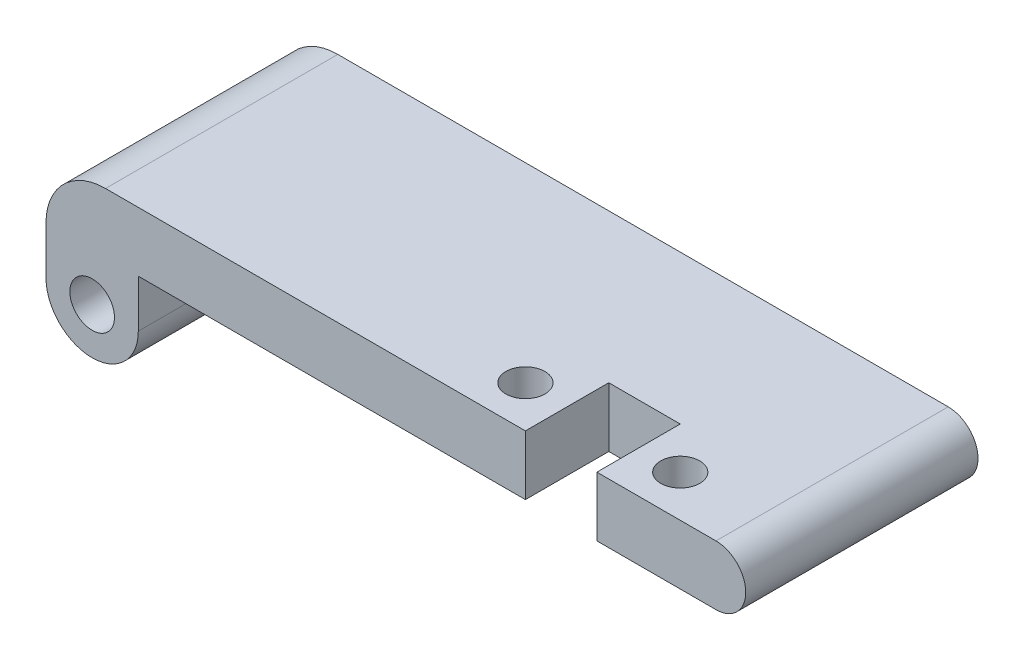
ISO-10303-21;
HEADER;
FILE_DESCRIPTION(('STEP AP214'),'2;1');
FILE_NAME('part.step','',(''),(''),'','','');
FILE_SCHEMA(('AUTOMOTIVE_DESIGN { 1 0 10303 214 1 1 1 1 }'));
ENDSEC;
DATA;
#1=APPLICATION_CONTEXT('core data for automotive mechanical design processes');
#2=APPLICATION_PROTOCOL_DEFINITION('international standard','automotive_design',2000,#1);
#3=PRODUCT_CONTEXT('',#1,'mechanical');
#4=PRODUCT('Part','Part','',(#3));
#5=PRODUCT_RELATED_PRODUCT_CATEGORY('part','',(#4));
#6=PRODUCT_DEFINITION_FORMATION('','',#4);
#7=PRODUCT_DEFINITION_CONTEXT('part definition',#1,'design');
#8=PRODUCT_DEFINITION('design','',#6,#7);
#9=PRODUCT_DEFINITION_SHAPE('','',#8);
#10=(LENGTH_UNIT() NAMED_UNIT(*) SI_UNIT(.MILLI.,.METRE.));
#11=(NAMED_UNIT(*) PLANE_ANGLE_UNIT() SI_UNIT($,.RADIAN.));
#12=(NAMED_UNIT(*) SI_UNIT($,.STERADIAN.) SOLID_ANGLE_UNIT());
#13=UNCERTAINTY_MEASURE_WITH_UNIT(LENGTH_MEASURE(1.E-05),#10,'distance_accuracy_value','');
#14=(GEOMETRIC_REPRESENTATION_CONTEXT(3) GLOBAL_UNCERTAINTY_ASSIGNED_CONTEXT((#13)) GLOBAL_UNIT_ASSIGNED_CONTEXT((#10,
#11,#12)) REPRESENTATION_CONTEXT('',''));
#15=CARTESIAN_POINT('',(0.,0.,0.));
#16=DIRECTION('',(0.,0.,1.));
#17=DIRECTION('',(1.,0.,0.));
#18=AXIS2_PLACEMENT_3D('',#15,#16,#17);
#19=CARTESIAN_POINT('',(-27.543125,-3.175,38.1));
#20=DIRECTION('',(0.,1.,0.));
#21=DIRECTION('',(0.,0.,1.));
#22=AXIS2_PLACEMENT_3D('',#19,#20,#21);
#23=PLANE('',#22);
#24=CARTESIAN_POINT('',(9.28687500000001,-3.175,20.32));
#25=DIRECTION('',(0.,1.,0.));
#26=DIRECTION('',(0.,0.,1.));
#27=AXIS2_PLACEMENT_3D('',#24,#25,#26);
#28=CIRCLE('',#27,2.0828);
#29=CARTESIAN_POINT('',(9.28687500000001,-3.175,18.2372));
#30=VERTEX_POINT('',#29);
#31=EDGE_CURVE('E265',#30,#30,#28,.F.);
#32=ORIENTED_EDGE('',*,*,#31,.F.);
#33=EDGE_LOOP('',(#32));
#34=FACE_BOUND('',#33,.T.);
#35=CARTESIAN_POINT('',(25.796875,-3.175,20.32));
#36=DIRECTION('',(0.,1.,0.));
#37=DIRECTION('',(0.,0.,1.));
#38=AXIS2_PLACEMENT_3D('',#35,#36,#37);
#39=CIRCLE('',#38,2.0828);
#40=CARTESIAN_POINT('',(25.796875,-3.175,18.2372));
#41=VERTEX_POINT('',#40);
#42=EDGE_CURVE('E279',#41,#41,#39,.F.);
#43=ORIENTED_EDGE('',*,*,#42,.F.);
#44=EDGE_LOOP('',(#43));
#45=FACE_BOUND('',#44,.T.);
#46=DIRECTION('',(0.,0.,1.));
#47=VECTOR('',#46,1.);
#48=CARTESIAN_POINT('',(34.051875,-3.175,0.));
#49=LINE('',#48,#47);
#50=CARTESIAN_POINT('',(34.051875,-3.175,0.));
#51=VERTEX_POINT('',#50);
#52=CARTESIAN_POINT('',(34.051875,-3.175,24.765));
#53=VERTEX_POINT('',#52);
#54=EDGE_CURVE('E123',#51,#53,#49,.T.);
#55=ORIENTED_EDGE('',*,*,#54,.T.);
#56=DIRECTION('',(-1.,0.,0.));
#57=VECTOR('',#56,1.);
#58=CARTESIAN_POINT('',(-27.543125,-3.175,24.765));
#59=LINE('',#58,#57);
#60=CARTESIAN_POINT('',(21.351875,-3.175,24.765));
#61=VERTEX_POINT('',#60);
#62=EDGE_CURVE('E65',#53,#61,#59,.T.);
#63=ORIENTED_EDGE('',*,*,#62,.T.);
#64=DIRECTION('',(0.,0.,-1.));
#65=VECTOR('',#64,1.);
#66=CARTESIAN_POINT('',(21.351875,-3.175,24.765));
#67=LINE('',#66,#65);
#68=CARTESIAN_POINT('',(21.351875,-3.175,15.875));
#69=VERTEX_POINT('',#68);
#70=EDGE_CURVE('E280',#61,#69,#67,.T.);
#71=ORIENTED_EDGE('',*,*,#70,.T.);
#72=DIRECTION('',(-1.,0.,0.));
#73=VECTOR('',#72,1.);
#74=CARTESIAN_POINT('',(-27.543125,-3.175,15.875));
#75=LINE('',#74,#73);
#76=CARTESIAN_POINT('',(13.731875,-3.175,15.875));
#77=VERTEX_POINT('',#76);
#78=EDGE_CURVE('E257',#69,#77,#75,.T.);
#79=ORIENTED_EDGE('',*,*,#78,.T.);
#80=DIRECTION('',(0.,0.,1.));
#81=VECTOR('',#80,1.);
#82=CARTESIAN_POINT('',(13.731875,-3.175,15.875));
#83=LINE('',#82,#81);
#84=CARTESIAN_POINT('',(13.731875,-3.175,24.765));
#85=VERTEX_POINT('',#84);
#86=EDGE_CURVE('E255',#77,#85,#83,.T.);
#87=ORIENTED_EDGE('',*,*,#86,.T.);
#88=CARTESIAN_POINT('',(-27.543125,-3.175,24.765));
#89=VERTEX_POINT('',#88);
#90=EDGE_CURVE('E204',#85,#89,#59,.T.);
#91=ORIENTED_EDGE('',*,*,#90,.T.);
#92=DIRECTION('',(0.,0.,-1.));
#93=VECTOR('',#92,1.);
#94=CARTESIAN_POINT('',(-27.543125,-3.175,38.1));
#95=LINE('',#94,#93);
#96=CARTESIAN_POINT('',(-27.543125,-3.175,0.));
#97=VERTEX_POINT('',#96);
#98=EDGE_CURVE('E144',#89,#97,#95,.T.);
#99=ORIENTED_EDGE('',*,*,#98,.T.);
#100=DIRECTION('',(1.,0.,0.));
#101=VECTOR('',#100,1.);
#102=CARTESIAN_POINT('',(-27.543125,-3.175,0.));
#103=LINE('',#102,#101);
#104=EDGE_CURVE('E137',#97,#51,#103,.T.);
#105=ORIENTED_EDGE('',*,*,#104,.T.);
#106=EDGE_LOOP('',(#55,#63,#71,#79,#87,#91,#99,#105));
#107=FACE_BOUND('',#106,.T.);
#108=ADVANCED_FACE('F41',(#34,#45,#107),#23,.F.);
#109=CARTESIAN_POINT('',(21.351875,-6.35,24.765));
#110=DIRECTION('',(0.,0.,1.));
#111=DIRECTION('',(1.,0.,0.));
#112=AXIS2_PLACEMENT_3D('',#109,#110,#111);
#113=PLANE('',#112);
#114=ORIENTED_EDGE('',*,*,#90,.F.);
#115=DIRECTION('',(0.,1.,0.));
#116=VECTOR('',#115,1.);
#117=CARTESIAN_POINT('',(13.731875,-13.17625,24.765));
#118=LINE('',#117,#116);
#119=CARTESIAN_POINT('',(13.731875,3.17499999999999,24.765));
#120=VERTEX_POINT('',#119);
#121=EDGE_CURVE('E270',#85,#120,#118,.T.);
#122=ORIENTED_EDGE('',*,*,#121,.T.);
#123=DIRECTION('',(1.,0.,0.));
#124=VECTOR('',#123,1.);
#125=CARTESIAN_POINT('',(50.085625,3.175,24.765));
#126=LINE('',#125,#124);
#127=CARTESIAN_POINT('',(-31.035625,3.175,24.765));
#128=VERTEX_POINT('',#127);
#129=EDGE_CURVE('E180',#128,#120,#126,.T.);
#130=ORIENTED_EDGE('',*,*,#129,.F.);
#131=CARTESIAN_POINT('',(-31.035625,-3.175,24.765));
#132=DIRECTION('',(0.,0.,1.));
#133=DIRECTION('',(1.,0.,0.));
#134=AXIS2_PLACEMENT_3D('',#131,#132,#133);
#135=CIRCLE('',#134,6.35);
#136=CARTESIAN_POINT('',(-37.385625,-3.175,24.765));
#137=VERTEX_POINT('',#136);
#138=EDGE_CURVE('E174',#137,#128,#135,.F.);
#139=ORIENTED_EDGE('',*,*,#138,.F.);
#140=DIRECTION('',(0.,1.,0.));
#141=VECTOR('',#140,1.);
#142=CARTESIAN_POINT('',(-37.385625,-3.175,24.765));
#143=LINE('',#142,#141);
#144=CARTESIAN_POINT('',(-37.385625,-8.255,24.765));
#145=VERTEX_POINT('',#144);
#146=EDGE_CURVE('E210',#145,#137,#143,.T.);
#147=ORIENTED_EDGE('',*,*,#146,.F.);
#148=CARTESIAN_POINT('',(-32.464375,-8.255,24.765));
#149=DIRECTION('',(0.,0.,1.));
#150=DIRECTION('',(1.,0.,0.));
#151=AXIS2_PLACEMENT_3D('',#148,#149,#150);
#152=CIRCLE('',#151,4.92125);
#153=CARTESIAN_POINT('',(-27.543125,-8.255,24.765));
#154=VERTEX_POINT('',#153);
#155=EDGE_CURVE('E205',#154,#145,#152,.F.);
#156=ORIENTED_EDGE('',*,*,#155,.F.);
#157=DIRECTION('',(0.,-1.,0.));
#158=VECTOR('',#157,1.);
#159=CARTESIAN_POINT('',(-27.543125,-8.255,24.765));
#160=LINE('',#159,#158);
#161=EDGE_CURVE('E201',#89,#154,#160,.T.);
#162=ORIENTED_EDGE('',*,*,#161,.F.);
#163=EDGE_LOOP('',(#114,#122,#130,#139,#147,#156,#162));
#164=FACE_BOUND('',#163,.T.);
#165=CARTESIAN_POINT('',(-32.464375,-8.255,24.765));
#166=DIRECTION('',(0.,0.,1.));
#167=DIRECTION('',(1.,0.,0.));
#168=AXIS2_PLACEMENT_3D('',#165,#166,#167);
#169=CIRCLE('',#168,2.38125);
#170=CARTESIAN_POINT('',(-34.845625,-8.255,24.765));
#171=VERTEX_POINT('',#170);
#172=EDGE_CURVE('E220',#171,#171,#169,.T.);
#173=ORIENTED_EDGE('',*,*,#172,.F.);
#174=EDGE_LOOP('',(#173));
#175=FACE_BOUND('',#174,.T.);
#176=ADVANCED_FACE('F276',(#164,#175),#113,.T.);
#177=CARTESIAN_POINT('',(-37.385625,3.175,38.1));
#178=DIRECTION('',(0.,-1.,0.));
#179=DIRECTION('',(0.,0.,-1.));
#180=AXIS2_PLACEMENT_3D('',#177,#178,#179);
#181=PLANE('',#180);
#182=CARTESIAN_POINT('',(25.796875,3.175,20.32));
#183=DIRECTION('',(0.,-1.,0.));
#184=DIRECTION('',(0.,0.,-1.));
#185=AXIS2_PLACEMENT_3D('',#182,#183,#184);
#186=CIRCLE('',#185,2.0828);
#187=CARTESIAN_POINT('',(25.796875,3.175,18.2372));
#188=VERTEX_POINT('',#187);
#189=EDGE_CURVE('E224',#188,#188,#186,.T.);
#190=ORIENTED_EDGE('',*,*,#189,.T.);
#191=EDGE_LOOP('',(#190));
#192=FACE_BOUND('',#191,.T.);
#193=CARTESIAN_POINT('',(9.28687500000001,3.175,20.32));
#194=DIRECTION('',(0.,-1.,0.));
#195=DIRECTION('',(0.,0.,-1.));
#196=AXIS2_PLACEMENT_3D('',#193,#194,#195);
#197=CIRCLE('',#196,2.0828);
#198=CARTESIAN_POINT('',(9.28687500000001,3.175,18.2372));
#199=VERTEX_POINT('',#198);
#200=EDGE_CURVE('E228',#199,#199,#197,.T.);
#201=ORIENTED_EDGE('',*,*,#200,.T.);
#202=EDGE_LOOP('',(#201));
#203=FACE_BOUND('',#202,.T.);
#204=CARTESIAN_POINT('',(21.351875,3.17499999999999,24.765));
#205=VERTEX_POINT('',#204);
#206=CARTESIAN_POINT('',(34.051875,3.175,24.765));
#207=VERTEX_POINT('',#206);
#208=EDGE_CURVE('E215',#205,#207,#126,.T.);
#209=ORIENTED_EDGE('',*,*,#208,.T.);
#210=DIRECTION('',(0.,0.,1.));
#211=VECTOR('',#210,1.);
#212=CARTESIAN_POINT('',(34.051875,3.17499999999999,0.));
#213=LINE('',#212,#211);
#214=CARTESIAN_POINT('',(34.051875,3.17499999999999,0.));
#215=VERTEX_POINT('',#214);
#216=EDGE_CURVE('E57',#215,#207,#213,.T.);
#217=ORIENTED_EDGE('',*,*,#216,.F.);
#218=DIRECTION('',(-1.,0.,0.));
#219=VECTOR('',#218,1.);
#220=CARTESIAN_POINT('',(-37.385625,3.175,0.));
#221=LINE('',#220,#219);
#222=CARTESIAN_POINT('',(-31.035625,3.175,0.));
#223=VERTEX_POINT('',#222);
#224=EDGE_CURVE('E139',#215,#223,#221,.T.);
#225=ORIENTED_EDGE('',*,*,#224,.T.);
#226=DIRECTION('',(0.,0.,-1.));
#227=VECTOR('',#226,1.);
#228=CARTESIAN_POINT('',(-31.035625,3.175,38.1));
#229=LINE('',#228,#227);
#230=EDGE_CURVE('E11',#223,#128,#229,.F.);
#231=ORIENTED_EDGE('',*,*,#230,.T.);
#232=ORIENTED_EDGE('',*,*,#129,.T.);
#233=DIRECTION('',(0.,0.,1.));
#234=VECTOR('',#233,1.);
#235=CARTESIAN_POINT('',(13.731875,3.175,24.765));
#236=LINE('',#235,#234);
#237=CARTESIAN_POINT('',(13.731875,3.17499999999999,15.875));
#238=VERTEX_POINT('',#237);
#239=EDGE_CURVE('E232',#238,#120,#236,.T.);
#240=ORIENTED_EDGE('',*,*,#239,.F.);
#241=DIRECTION('',(-1.,0.,0.));
#242=VECTOR('',#241,1.);
#243=CARTESIAN_POINT('',(21.351875,3.175,15.875));
#244=LINE('',#243,#242);
#245=CARTESIAN_POINT('',(21.351875,3.17499999999999,15.875));
#246=VERTEX_POINT('',#245);
#247=EDGE_CURVE('E188',#246,#238,#244,.T.);
#248=ORIENTED_EDGE('',*,*,#247,.F.);
#249=DIRECTION('',(0.,0.,-1.));
#250=VECTOR('',#249,1.);
#251=CARTESIAN_POINT('',(21.351875,3.175,24.765));
#252=LINE('',#251,#250);
#253=EDGE_CURVE('E236',#205,#246,#252,.T.);
#254=ORIENTED_EDGE('',*,*,#253,.F.);
#255=EDGE_LOOP('',(#209,#217,#225,#231,#232,#240,#248,#254));
#256=FACE_BOUND('',#255,.T.);
#257=ADVANCED_FACE('F178',(#192,#203,#256),#181,.F.);
#258=CARTESIAN_POINT('',(-37.385625,-8.255,38.1));
#259=DIRECTION('',(1.,0.,0.));
#260=DIRECTION('',(0.,0.,-1.));
#261=AXIS2_PLACEMENT_3D('',#258,#259,#260);
#262=PLANE('',#261);
#263=ORIENTED_EDGE('',*,*,#146,.T.);
#264=DIRECTION('',(0.,0.,-1.));
#265=VECTOR('',#264,1.);
#266=CARTESIAN_POINT('',(-37.385625,-3.175,38.1));
#267=LINE('',#266,#265);
#268=CARTESIAN_POINT('',(-37.385625,-3.175,0.));
#269=VERTEX_POINT('',#268);
#270=EDGE_CURVE('E162',#137,#269,#267,.T.);
#271=ORIENTED_EDGE('',*,*,#270,.T.);
#272=DIRECTION('',(0.,-1.,0.));
#273=VECTOR('',#272,1.);
#274=CARTESIAN_POINT('',(-37.385625,-8.255,0.));
#275=LINE('',#274,#273);
#276=CARTESIAN_POINT('',(-37.385625,-8.255,0.));
#277=VERTEX_POINT('',#276);
#278=EDGE_CURVE('E170',#269,#277,#275,.T.);
#279=ORIENTED_EDGE('',*,*,#278,.T.);
#280=DIRECTION('',(0.,0.,-1.));
#281=VECTOR('',#280,1.);
#282=CARTESIAN_POINT('',(-37.385625,-8.255,38.1));
#283=LINE('',#282,#281);
#284=EDGE_CURVE('E159',#145,#277,#283,.T.);
#285=ORIENTED_EDGE('',*,*,#284,.F.);
#286=EDGE_LOOP('',(#263,#271,#279,#285));
#287=FACE_BOUND('',#286,.T.);
#288=ADVANCED_FACE('F275',(#287),#262,.F.);
#289=CARTESIAN_POINT('',(-32.464375,-8.255,38.1));
#290=DIRECTION('',(0.,0.,-1.));
#291=DIRECTION('',(-1.,0.,0.));
#292=AXIS2_PLACEMENT_3D('',#289,#290,#291);
#293=CYLINDRICAL_SURFACE('',#292,4.92125);
#294=ORIENTED_EDGE('',*,*,#155,.T.);
#295=ORIENTED_EDGE('',*,*,#284,.T.);
#296=CARTESIAN_POINT('',(-32.464375,-8.255,0.));
#297=DIRECTION('',(0.,0.,1.));
#298=DIRECTION('',(1.,0.,0.));
#299=AXIS2_PLACEMENT_3D('',#296,#297,#298);
#300=CIRCLE('',#299,4.92125);
#301=CARTESIAN_POINT('',(-27.543125,-8.255,0.));
#302=VERTEX_POINT('',#301);
#303=EDGE_CURVE('E153',#277,#302,#300,.T.);
#304=ORIENTED_EDGE('',*,*,#303,.T.);
#305=DIRECTION('',(0.,0.,-1.));
#306=VECTOR('',#305,1.);
#307=CARTESIAN_POINT('',(-27.543125,-8.255,38.1));
#308=LINE('',#307,#306);
#309=EDGE_CURVE('E151',#154,#302,#308,.T.);
#310=ORIENTED_EDGE('',*,*,#309,.F.);
#311=EDGE_LOOP('',(#294,#295,#304,#310));
#312=FACE_BOUND('',#311,.T.);
#313=ADVANCED_FACE('F196',(#312),#293,.T.);
#314=CARTESIAN_POINT('',(-27.543125,-8.255,38.1));
#315=DIRECTION('',(-1.,0.,0.));
#316=DIRECTION('',(0.,0.,1.));
#317=AXIS2_PLACEMENT_3D('',#314,#315,#316);
#318=PLANE('',#317);
#319=ORIENTED_EDGE('',*,*,#161,.T.);
#320=ORIENTED_EDGE('',*,*,#309,.T.);
#321=DIRECTION('',(0.,1.,0.));
#322=VECTOR('',#321,1.);
#323=CARTESIAN_POINT('',(-27.543125,-8.255,0.));
#324=LINE('',#323,#322);
#325=EDGE_CURVE('E147',#302,#97,#324,.T.);
#326=ORIENTED_EDGE('',*,*,#325,.T.);
#327=ORIENTED_EDGE('',*,*,#98,.F.);
#328=EDGE_LOOP('',(#319,#320,#326,#327));
#329=FACE_BOUND('',#328,.T.);
#330=ADVANCED_FACE('F200',(#329),#318,.F.);
#331=CARTESIAN_POINT('',(-32.464375,-8.255,38.1));
#332=DIRECTION('',(0.,0.,-1.));
#333=DIRECTION('',(-1.,0.,0.));
#334=AXIS2_PLACEMENT_3D('',#331,#332,#333);
#335=CYLINDRICAL_SURFACE('',#334,2.38125);
#336=CARTESIAN_POINT('',(-32.464375,-8.255,0.));
#337=DIRECTION('',(0.,0.,1.));
#338=DIRECTION('',(1.,0.,0.));
#339=AXIS2_PLACEMENT_3D('',#336,#337,#338);
#340=CIRCLE('',#339,2.38125);
#341=CARTESIAN_POINT('',(-34.845625,-8.255,0.));
#342=VERTEX_POINT('',#341);
#343=EDGE_CURVE('E182',#342,#342,#340,.T.);
#344=CARTESIAN_POINT('',(-34.845625,-8.255,0.));
#345=CARTESIAN_POINT('',(-34.845625,-8.255,0.257968749999999));
#346=CARTESIAN_POINT('',(-34.845625,-8.255,0.515937499999998));
#347=CARTESIAN_POINT('',(-34.845625,-8.255,1.031875));
#348=CARTESIAN_POINT('',(-34.845625,-8.255,1.28984375));
#349=CARTESIAN_POINT('',(-34.845625,-8.255,1.80578125));
#350=CARTESIAN_POINT('',(-34.845625,-8.255,2.06375));
#351=CARTESIAN_POINT('',(-34.845625,-8.255,2.5796875));
#352=CARTESIAN_POINT('',(-34.845625,-8.255,2.83765625));
#353=CARTESIAN_POINT('',(-34.845625,-8.255,3.35359375));
#354=CARTESIAN_POINT('',(-34.845625,-8.255,3.6115625));
#355=CARTESIAN_POINT('',(-34.845625,-8.255,4.1275));
#356=CARTESIAN_POINT('',(-34.845625,-8.255,4.38546875000001));
#357=CARTESIAN_POINT('',(-34.845625,-8.255,4.90140625000001));
#358=CARTESIAN_POINT('',(-34.845625,-8.255,5.15937500000001));
#359=CARTESIAN_POINT('',(-34.845625,-8.255,5.67531250000001));
#360=CARTESIAN_POINT('',(-34.845625,-8.255,5.93328125000001));
#361=CARTESIAN_POINT('',(-34.845625,-8.255,6.44921875000001));
#362=CARTESIAN_POINT('',(-34.845625,-8.255,6.70718750000001));
#363=CARTESIAN_POINT('',(-34.845625,-8.255,7.22312500000001));
#364=CARTESIAN_POINT('',(-34.845625,-8.255,7.48109375000001));
#365=CARTESIAN_POINT('',(-34.845625,-8.255,7.99703125000001));
#366=CARTESIAN_POINT('',(-34.845625,-8.255,8.25500000000001));
#367=CARTESIAN_POINT('',(-34.845625,-8.255,8.77093750000001));
#368=CARTESIAN_POINT('',(-34.845625,-8.255,9.02890625000001));
#369=CARTESIAN_POINT('',(-34.845625,-8.255,9.54484375000001));
#370=CARTESIAN_POINT('',(-34.845625,-8.255,9.80281250000001));
#371=CARTESIAN_POINT('',(-34.845625,-8.255,10.31875));
#372=CARTESIAN_POINT('',(-34.845625,-8.255,10.57671875));
#373=CARTESIAN_POINT('',(-34.845625,-8.255,11.09265625));
#374=CARTESIAN_POINT('',(-34.845625,-8.255,11.350625));
#375=CARTESIAN_POINT('',(-34.845625,-8.255,11.8665625));
#376=CARTESIAN_POINT('',(-34.845625,-8.255,12.12453125));
#377=CARTESIAN_POINT('',(-34.845625,-8.255,12.64046875));
#378=CARTESIAN_POINT('',(-34.845625,-8.255,12.8984375));
#379=CARTESIAN_POINT('',(-34.845625,-8.255,13.414375));
#380=CARTESIAN_POINT('',(-34.845625,-8.255,13.67234375));
#381=CARTESIAN_POINT('',(-34.845625,-8.255,14.18828125));
#382=CARTESIAN_POINT('',(-34.845625,-8.255,14.44625));
#383=CARTESIAN_POINT('',(-34.845625,-8.255,14.9621875));
#384=CARTESIAN_POINT('',(-34.845625,-8.255,15.22015625));
#385=CARTESIAN_POINT('',(-34.845625,-8.255,15.73609375));
#386=CARTESIAN_POINT('',(-34.845625,-8.255,15.9940625));
#387=CARTESIAN_POINT('',(-34.845625,-8.255,16.51));
#388=CARTESIAN_POINT('',(-34.845625,-8.255,16.76796875));
#389=CARTESIAN_POINT('',(-34.845625,-8.255,17.28390625));
#390=CARTESIAN_POINT('',(-34.845625,-8.255,17.541875));
#391=CARTESIAN_POINT('',(-34.845625,-8.255,18.0578125));
#392=CARTESIAN_POINT('',(-34.845625,-8.255,18.31578125));
#393=CARTESIAN_POINT('',(-34.845625,-8.255,18.83171875));
#394=CARTESIAN_POINT('',(-34.845625,-8.255,19.0896875));
#395=CARTESIAN_POINT('',(-34.845625,-8.255,19.605625));
#396=CARTESIAN_POINT('',(-34.845625,-8.255,19.86359375));
#397=CARTESIAN_POINT('',(-34.845625,-8.255,20.37953125));
#398=CARTESIAN_POINT('',(-34.845625,-8.255,20.6375));
#399=CARTESIAN_POINT('',(-34.845625,-8.255,21.1534375));
#400=CARTESIAN_POINT('',(-34.845625,-8.255,21.41140625));
#401=CARTESIAN_POINT('',(-34.845625,-8.255,21.92734375));
#402=CARTESIAN_POINT('',(-34.845625,-8.255,22.1853125));
#403=CARTESIAN_POINT('',(-34.845625,-8.255,22.70125));
#404=CARTESIAN_POINT('',(-34.845625,-8.255,22.95921875));
#405=CARTESIAN_POINT('',(-34.845625,-8.255,23.47515625));
#406=CARTESIAN_POINT('',(-34.845625,-8.255,23.733125));
#407=CARTESIAN_POINT('',(-34.845625,-8.255,24.2490625));
#408=CARTESIAN_POINT('',(-34.845625,-8.255,24.50703125));
#409=CARTESIAN_POINT('',(-34.845625,-8.255,24.765));
#410=B_SPLINE_CURVE_WITH_KNOTS('',3,(#344,#345,#346,#347,#348,#349,#350,#351,#352,#353,#354,
#355,#356,#357,#358,#359,#360,#361,#362,#363,#364,#365,#366,#367,#368,#369,#370,#371,#372,#373,
#374,#375,#376,#377,#378,#379,#380,#381,#382,#383,#384,#385,#386,#387,#388,#389,#390,#391,#392,
#393,#394,#395,#396,#397,#398,#399,#400,#401,#402,#403,#404,#405,#406,#407,#408,#409),
.UNSPECIFIED.,.F.,.F.,(4,2,2,2,2,2,2,2,2,2,2,2,2,2,2,2,2,2,2,2,2,2,2,2,2,2,2,2,2,2,2,2,4),(0.,
0.773906249999998,1.5478125,2.32171875,3.095625,3.86953125,4.64343750000001,5.41734375000001,
6.19125000000001,6.96515625000001,7.73906250000001,8.51296875000001,9.28687500000001,
10.06078125,10.8346875,11.60859375,12.3825,13.15640625,13.9303125,14.70421875,15.478125,
16.25203125,17.0259375,17.79984375,18.57375,19.34765625,20.1215625,20.89546875,21.669375,
22.44328125,23.2171875,23.99109375,24.765),.UNSPECIFIED.);
#411=EDGE_CURVE('BSEAM320',#342,#171,#410,.T.);
#412=ORIENTED_EDGE('',*,*,#343,.F.);
#413=ORIENTED_EDGE('',*,*,#172,.T.);
#414=ORIENTED_EDGE('',*,*,#411,.T.);
#415=ORIENTED_EDGE('',*,*,#411,.F.);
#416=EDGE_LOOP('',(#412,#414,#413,#415));
#417=FACE_BOUND('',#416,.T.);
#418=ADVANCED_FACE('F320',(#417),#335,.F.);
#419=CARTESIAN_POINT('',(-31.035625,-3.175,38.1));
#420=DIRECTION('',(0.,0.,-1.));
#421=DIRECTION('',(-1.,0.,0.));
#422=AXIS2_PLACEMENT_3D('',#419,#420,#421);
#423=CYLINDRICAL_SURFACE('',#422,6.35);
#424=ORIENTED_EDGE('',*,*,#270,.F.);
#425=ORIENTED_EDGE('',*,*,#138,.T.);
#426=ORIENTED_EDGE('',*,*,#230,.F.);
#427=CARTESIAN_POINT('',(-31.035625,-3.175,0.));
#428=DIRECTION('',(0.,0.,1.));
#429=DIRECTION('',(1.,0.,0.));
#430=AXIS2_PLACEMENT_3D('',#427,#428,#429);
#431=CIRCLE('',#430,6.35);
#432=EDGE_CURVE('E50',#269,#223,#431,.F.);
#433=ORIENTED_EDGE('',*,*,#432,.F.);
#434=EDGE_LOOP('',(#424,#425,#426,#433));
#435=FACE_BOUND('',#434,.T.);
#436=ADVANCED_FACE('F43',(#435),#423,.T.);
#437=CARTESIAN_POINT('',(-32.464375,-8.255,0.));
#438=DIRECTION('',(0.,0.,1.));
#439=DIRECTION('',(1.,0.,0.));
#440=AXIS2_PLACEMENT_3D('',#437,#438,#439);
#441=PLANE('',#440);
#442=ORIENTED_EDGE('',*,*,#224,.F.);
#443=CARTESIAN_POINT('',(34.051875,0.,0.));
#444=DIRECTION('',(0.,0.,-1.));
#445=DIRECTION('',(1.,0.,0.));
#446=AXIS2_PLACEMENT_3D('',#443,#444,#445);
#447=CIRCLE('',#446,3.175);
#448=EDGE_CURVE('E126',#215,#51,#447,.T.);
#449=ORIENTED_EDGE('',*,*,#448,.T.);
#450=ORIENTED_EDGE('',*,*,#104,.F.);
#451=ORIENTED_EDGE('',*,*,#325,.F.);
#452=ORIENTED_EDGE('',*,*,#303,.F.);
#453=ORIENTED_EDGE('',*,*,#278,.F.);
#454=ORIENTED_EDGE('',*,*,#432,.T.);
#455=EDGE_LOOP('',(#442,#449,#450,#451,#452,#453,#454));
#456=FACE_BOUND('',#455,.T.);
#457=ORIENTED_EDGE('',*,*,#343,.T.);
#458=EDGE_LOOP('',(#457));
#459=FACE_BOUND('',#458,.T.);
#460=ADVANCED_FACE('F134',(#456,#459),#441,.F.);
#461=CARTESIAN_POINT('',(34.051875,0.,24.765));
#462=DIRECTION('',(0.,0.,-1.));
#463=DIRECTION('',(1.,0.,0.));
#464=AXIS2_PLACEMENT_3D('',#461,#462,#463);
#465=CIRCLE('',#464,3.175);
#466=EDGE_CURVE('E127',#207,#53,#465,.T.);
#467=ORIENTED_EDGE('',*,*,#466,.F.);
#468=ORIENTED_EDGE('',*,*,#208,.F.);
#469=DIRECTION('',(0.,1.,0.));
#470=VECTOR('',#469,1.);
#471=CARTESIAN_POINT('',(21.351875,-13.17625,24.765));
#472=LINE('',#471,#470);
#473=EDGE_CURVE('E262',#61,#205,#472,.T.);
#474=ORIENTED_EDGE('',*,*,#473,.F.);
#475=ORIENTED_EDGE('',*,*,#62,.F.);
#476=EDGE_LOOP('',(#467,#468,#474,#475));
#477=FACE_BOUND('',#476,.T.);
#478=ADVANCED_FACE('F296',(#477),#113,.T.);
#479=CARTESIAN_POINT('',(25.796875,25.4,20.32));
#480=DIRECTION('',(0.,-1.,0.));
#481=DIRECTION('',(0.,0.,-1.));
#482=AXIS2_PLACEMENT_3D('',#479,#480,#481);
#483=CYLINDRICAL_SURFACE('',#482,2.0828);
#484=CARTESIAN_POINT('',(25.796875,-3.175,18.2372));
#485=CARTESIAN_POINT('',(25.796875,-3.10885416666666,18.2372));
#486=CARTESIAN_POINT('',(25.796875,-3.04270833333333,18.2372));
#487=CARTESIAN_POINT('',(25.796875,-2.91041666666666,18.2372));
#488=CARTESIAN_POINT('',(25.796875,-2.84427083333333,18.2372));
#489=CARTESIAN_POINT('',(25.796875,-2.71197916666666,18.2372));
#490=CARTESIAN_POINT('',(25.796875,-2.64583333333333,18.2372));
#491=CARTESIAN_POINT('',(25.796875,-2.51354166666666,18.2372));
#492=CARTESIAN_POINT('',(25.796875,-2.44739583333333,18.2372));
#493=CARTESIAN_POINT('',(25.796875,-2.31510416666666,18.2372));
#494=CARTESIAN_POINT('',(25.796875,-2.24895833333333,18.2372));
#495=CARTESIAN_POINT('',(25.796875,-2.11666666666666,18.2372));
#496=CARTESIAN_POINT('',(25.796875,-2.05052083333333,18.2372));
#497=CARTESIAN_POINT('',(25.796875,-1.91822916666666,18.2372));
#498=CARTESIAN_POINT('',(25.796875,-1.85208333333333,18.2372));
#499=CARTESIAN_POINT('',(25.796875,-1.71979166666666,18.2372));
#500=CARTESIAN_POINT('',(25.796875,-1.65364583333333,18.2372));
#501=CARTESIAN_POINT('',(25.796875,-1.52135416666666,18.2372));
#502=CARTESIAN_POINT('',(25.796875,-1.45520833333333,18.2372));
#503=CARTESIAN_POINT('',(25.796875,-1.32291666666666,18.2372));
#504=CARTESIAN_POINT('',(25.796875,-1.25677083333333,18.2372));
#505=CARTESIAN_POINT('',(25.796875,-1.12447916666666,18.2372));
#506=CARTESIAN_POINT('',(25.796875,-1.05833333333333,18.2372));
#507=CARTESIAN_POINT('',(25.796875,-0.926041666666664,18.2372));
#508=CARTESIAN_POINT('',(25.796875,-0.85989583333333,18.2372));
#509=CARTESIAN_POINT('',(25.796875,-0.727604166666663,18.2372));
#510=CARTESIAN_POINT('',(25.796875,-0.66145833333333,18.2372));
#511=CARTESIAN_POINT('',(25.796875,-0.529166666666664,18.2372));
#512=CARTESIAN_POINT('',(25.796875,-0.463020833333331,18.2372));
#513=CARTESIAN_POINT('',(25.796875,-0.330729166666664,18.2372));
#514=CARTESIAN_POINT('',(25.796875,-0.26458333333333,18.2372));
#515=CARTESIAN_POINT('',(25.796875,-0.132291666666663,18.2372));
#516=CARTESIAN_POINT('',(25.796875,-0.0661458333333295,18.2372));
#517=CARTESIAN_POINT('',(25.796875,0.0661458333333365,18.2372));
#518=CARTESIAN_POINT('',(25.796875,0.132291666666669,18.2372));
#519=CARTESIAN_POINT('',(25.796875,0.264583333333337,18.2372));
#520=CARTESIAN_POINT('',(25.796875,0.330729166666671,18.2372));
#521=CARTESIAN_POINT('',(25.796875,0.463020833333338,18.2372));
#522=CARTESIAN_POINT('',(25.796875,0.529166666666671,18.2372));
#523=CARTESIAN_POINT('',(25.796875,0.661458333333337,18.2372));
#524=CARTESIAN_POINT('',(25.796875,0.72760416666667,18.2372));
#525=CARTESIAN_POINT('',(25.796875,0.859895833333337,18.2372));
#526=CARTESIAN_POINT('',(25.796875,0.926041666666671,18.2372));
#527=CARTESIAN_POINT('',(25.796875,1.05833333333334,18.2372));
#528=CARTESIAN_POINT('',(25.796875,1.12447916666667,18.2372));
#529=CARTESIAN_POINT('',(25.796875,1.25677083333334,18.2372));
#530=CARTESIAN_POINT('',(25.796875,1.32291666666667,18.2372));
#531=CARTESIAN_POINT('',(25.796875,1.45520833333334,18.2372));
#532=CARTESIAN_POINT('',(25.796875,1.52135416666667,18.2372));
#533=CARTESIAN_POINT('',(25.796875,1.65364583333334,18.2372));
#534=CARTESIAN_POINT('',(25.796875,1.71979166666667,18.2372));
#535=CARTESIAN_POINT('',(25.796875,1.85208333333334,18.2372));
#536=CARTESIAN_POINT('',(25.796875,1.91822916666667,18.2372));
#537=CARTESIAN_POINT('',(25.796875,2.05052083333334,18.2372));
#538=CARTESIAN_POINT('',(25.796875,2.11666666666667,18.2372));
#539=CARTESIAN_POINT('',(25.796875,2.24895833333334,18.2372));
#540=CARTESIAN_POINT('',(25.796875,2.31510416666667,18.2372));
#541=CARTESIAN_POINT('',(25.796875,2.44739583333334,18.2372));
#542=CARTESIAN_POINT('',(25.796875,2.51354166666667,18.2372));
#543=CARTESIAN_POINT('',(25.796875,2.64583333333334,18.2372));
#544=CARTESIAN_POINT('',(25.796875,2.71197916666667,18.2372));
#545=CARTESIAN_POINT('',(25.796875,2.84427083333334,18.2372));
#546=CARTESIAN_POINT('',(25.796875,2.91041666666667,18.2372));
#547=CARTESIAN_POINT('',(25.796875,3.04270833333334,18.2372));
#548=CARTESIAN_POINT('',(25.796875,3.10885416666667,18.2372));
#549=CARTESIAN_POINT('',(25.796875,3.175,18.2372));
#550=B_SPLINE_CURVE_WITH_KNOTS('',3,(#484,#485,#486,#487,#488,#489,#490,#491,#492,#493,#494,
#495,#496,#497,#498,#499,#500,#501,#502,#503,#504,#505,#506,#507,#508,#509,#510,#511,#512,#513,
#514,#515,#516,#517,#518,#519,#520,#521,#522,#523,#524,#525,#526,#527,#528,#529,#530,#531,#532,
#533,#534,#535,#536,#537,#538,#539,#540,#541,#542,#543,#544,#545,#546,#547,#548,#549),
.UNSPECIFIED.,.F.,.F.,(4,2,2,2,2,2,2,2,2,2,2,2,2,2,2,2,2,2,2,2,2,2,2,2,2,2,2,2,2,2,2,2,4),(0.,
0.198437499999999,0.396875000000001,0.5953125,0.793749999999999,0.992187500000002,1.190625,
1.3890625,1.5875,1.7859375,1.984375,2.1828125,2.38125,2.5796875,2.778125,2.9765625,3.175,
3.3734375,3.571875,3.7703125,3.96875,4.1671875,4.365625,4.5640625,4.7625,4.9609375,5.159375,
5.3578125,5.55625,5.7546875,5.953125,6.1515625,6.35),.UNSPECIFIED.);
#551=EDGE_CURVE('BSEAM298',#41,#188,#550,.T.);
#552=ORIENTED_EDGE('',*,*,#42,.T.);
#553=ORIENTED_EDGE('',*,*,#189,.F.);
#554=ORIENTED_EDGE('',*,*,#551,.T.);
#555=ORIENTED_EDGE('',*,*,#551,.F.);
#556=EDGE_LOOP('',(#552,#554,#553,#555));
#557=FACE_BOUND('',#556,.T.);
#558=ADVANCED_FACE('F298',(#557),#483,.F.);
#559=CARTESIAN_POINT('',(9.28687500000001,25.4,20.32));
#560=DIRECTION('',(0.,-1.,0.));
#561=DIRECTION('',(0.,0.,-1.));
#562=AXIS2_PLACEMENT_3D('',#559,#560,#561);
#563=CYLINDRICAL_SURFACE('',#562,2.0828);
#564=CARTESIAN_POINT('',(9.28687500000001,-3.175,18.2372));
#565=CARTESIAN_POINT('',(9.28687500000001,-3.10885416666666,18.2372));
#566=CARTESIAN_POINT('',(9.28687500000001,-3.04270833333333,18.2372));
#567=CARTESIAN_POINT('',(9.28687500000001,-2.91041666666666,18.2372));
#568=CARTESIAN_POINT('',(9.28687500000001,-2.84427083333333,18.2372));
#569=CARTESIAN_POINT('',(9.28687500000001,-2.71197916666666,18.2372));
#570=CARTESIAN_POINT('',(9.28687500000001,-2.64583333333333,18.2372));
#571=CARTESIAN_POINT('',(9.28687500000001,-2.51354166666666,18.2372));
#572=CARTESIAN_POINT('',(9.28687500000001,-2.44739583333333,18.2372));
#573=CARTESIAN_POINT('',(9.28687500000001,-2.31510416666666,18.2372));
#574=CARTESIAN_POINT('',(9.28687500000001,-2.24895833333333,18.2372));
#575=CARTESIAN_POINT('',(9.28687500000001,-2.11666666666666,18.2372));
#576=CARTESIAN_POINT('',(9.28687500000001,-2.05052083333333,18.2372));
#577=CARTESIAN_POINT('',(9.28687500000001,-1.91822916666666,18.2372));
#578=CARTESIAN_POINT('',(9.28687500000001,-1.85208333333333,18.2372));
#579=CARTESIAN_POINT('',(9.28687500000001,-1.71979166666666,18.2372));
#580=CARTESIAN_POINT('',(9.28687500000001,-1.65364583333333,18.2372));
#581=CARTESIAN_POINT('',(9.28687500000001,-1.52135416666666,18.2372));
#582=CARTESIAN_POINT('',(9.28687500000001,-1.45520833333333,18.2372));
#583=CARTESIAN_POINT('',(9.28687500000001,-1.32291666666666,18.2372));
#584=CARTESIAN_POINT('',(9.28687500000001,-1.25677083333333,18.2372));
#585=CARTESIAN_POINT('',(9.28687500000001,-1.12447916666666,18.2372));
#586=CARTESIAN_POINT('',(9.28687500000001,-1.05833333333333,18.2372));
#587=CARTESIAN_POINT('',(9.28687500000001,-0.926041666666664,18.2372));
#588=CARTESIAN_POINT('',(9.28687500000001,-0.85989583333333,18.2372));
#589=CARTESIAN_POINT('',(9.28687500000001,-0.727604166666663,18.2372));
#590=CARTESIAN_POINT('',(9.28687500000001,-0.66145833333333,18.2372));
#591=CARTESIAN_POINT('',(9.28687500000001,-0.529166666666664,18.2372));
#592=CARTESIAN_POINT('',(9.28687500000001,-0.463020833333331,18.2372));
#593=CARTESIAN_POINT('',(9.28687500000001,-0.330729166666664,18.2372));
#594=CARTESIAN_POINT('',(9.28687500000001,-0.26458333333333,18.2372));
#595=CARTESIAN_POINT('',(9.28687500000001,-0.132291666666663,18.2372));
#596=CARTESIAN_POINT('',(9.28687500000001,-0.0661458333333295,18.2372));
#597=CARTESIAN_POINT('',(9.28687500000001,0.0661458333333365,18.2372));
#598=CARTESIAN_POINT('',(9.28687500000001,0.132291666666669,18.2372));
#599=CARTESIAN_POINT('',(9.28687500000001,0.264583333333337,18.2372));
#600=CARTESIAN_POINT('',(9.28687500000001,0.330729166666671,18.2372));
#601=CARTESIAN_POINT('',(9.28687500000001,0.463020833333338,18.2372));
#602=CARTESIAN_POINT('',(9.28687500000001,0.529166666666671,18.2372));
#603=CARTESIAN_POINT('',(9.28687500000001,0.661458333333337,18.2372));
#604=CARTESIAN_POINT('',(9.28687500000001,0.72760416666667,18.2372));
#605=CARTESIAN_POINT('',(9.28687500000001,0.859895833333337,18.2372));
#606=CARTESIAN_POINT('',(9.28687500000001,0.926041666666671,18.2372));
#607=CARTESIAN_POINT('',(9.28687500000001,1.05833333333334,18.2372));
#608=CARTESIAN_POINT('',(9.28687500000001,1.12447916666667,18.2372));
#609=CARTESIAN_POINT('',(9.28687500000001,1.25677083333334,18.2372));
#610=CARTESIAN_POINT('',(9.28687500000001,1.32291666666667,18.2372));
#611=CARTESIAN_POINT('',(9.28687500000001,1.45520833333334,18.2372));
#612=CARTESIAN_POINT('',(9.28687500000001,1.52135416666667,18.2372));
#613=CARTESIAN_POINT('',(9.28687500000001,1.65364583333334,18.2372));
#614=CARTESIAN_POINT('',(9.28687500000001,1.71979166666667,18.2372));
#615=CARTESIAN_POINT('',(9.28687500000001,1.85208333333334,18.2372));
#616=CARTESIAN_POINT('',(9.28687500000001,1.91822916666667,18.2372));
#617=CARTESIAN_POINT('',(9.28687500000001,2.05052083333334,18.2372));
#618=CARTESIAN_POINT('',(9.28687500000001,2.11666666666667,18.2372));
#619=CARTESIAN_POINT('',(9.28687500000001,2.24895833333334,18.2372));
#620=CARTESIAN_POINT('',(9.28687500000001,2.31510416666667,18.2372));
#621=CARTESIAN_POINT('',(9.28687500000001,2.44739583333334,18.2372));
#622=CARTESIAN_POINT('',(9.28687500000001,2.51354166666667,18.2372));
#623=CARTESIAN_POINT('',(9.28687500000001,2.64583333333334,18.2372));
#624=CARTESIAN_POINT('',(9.28687500000001,2.71197916666667,18.2372));
#625=CARTESIAN_POINT('',(9.28687500000001,2.84427083333334,18.2372));
#626=CARTESIAN_POINT('',(9.28687500000001,2.91041666666667,18.2372));
#627=CARTESIAN_POINT('',(9.28687500000001,3.04270833333334,18.2372));
#628=CARTESIAN_POINT('',(9.28687500000001,3.10885416666667,18.2372));
#629=CARTESIAN_POINT('',(9.28687500000001,3.175,18.2372));
#630=B_SPLINE_CURVE_WITH_KNOTS('',3,(#564,#565,#566,#567,#568,#569,#570,#571,#572,#573,#574,
#575,#576,#577,#578,#579,#580,#581,#582,#583,#584,#585,#586,#587,#588,#589,#590,#591,#592,#593,
#594,#595,#596,#597,#598,#599,#600,#601,#602,#603,#604,#605,#606,#607,#608,#609,#610,#611,#612,
#613,#614,#615,#616,#617,#618,#619,#620,#621,#622,#623,#624,#625,#626,#627,#628,#629),
.UNSPECIFIED.,.F.,.F.,(4,2,2,2,2,2,2,2,2,2,2,2,2,2,2,2,2,2,2,2,2,2,2,2,2,2,2,2,2,2,2,2,4),(0.,
0.198437499999999,0.396875000000001,0.5953125,0.793749999999999,0.992187500000002,1.190625,
1.3890625,1.5875,1.7859375,1.984375,2.1828125,2.38125,2.5796875,2.778125,2.9765625,3.175,
3.3734375,3.571875,3.7703125,3.96875,4.1671875,4.365625,4.5640625,4.7625,4.9609375,5.159375,
5.3578125,5.55625,5.7546875,5.953125,6.1515625,6.35),.UNSPECIFIED.);
#631=EDGE_CURVE('BSEAM304',#30,#199,#630,.T.);
#632=ORIENTED_EDGE('',*,*,#31,.T.);
#633=ORIENTED_EDGE('',*,*,#200,.F.);
#634=ORIENTED_EDGE('',*,*,#631,.T.);
#635=ORIENTED_EDGE('',*,*,#631,.F.);
#636=EDGE_LOOP('',(#632,#634,#633,#635));
#637=FACE_BOUND('',#636,.T.);
#638=ADVANCED_FACE('F304',(#637),#563,.F.);
#639=CARTESIAN_POINT('',(13.731875,-13.17625,15.875));
#640=DIRECTION('',(-1.,0.,0.));
#641=DIRECTION('',(0.,0.,1.));
#642=AXIS2_PLACEMENT_3D('',#639,#640,#641);
#643=PLANE('',#642);
#644=ORIENTED_EDGE('',*,*,#121,.F.);
#645=ORIENTED_EDGE('',*,*,#86,.F.);
#646=DIRECTION('',(0.,1.,0.));
#647=VECTOR('',#646,1.);
#648=CARTESIAN_POINT('',(13.731875,-13.17625,15.875));
#649=LINE('',#648,#647);
#650=EDGE_CURVE('E246',#77,#238,#649,.T.);
#651=ORIENTED_EDGE('',*,*,#650,.T.);
#652=ORIENTED_EDGE('',*,*,#239,.T.);
#653=EDGE_LOOP('',(#644,#645,#651,#652));
#654=FACE_BOUND('',#653,.T.);
#655=ADVANCED_FACE('F253',(#654),#643,.F.);
#656=CARTESIAN_POINT('',(21.351875,-13.17625,24.765));
#657=DIRECTION('',(1.,0.,0.));
#658=DIRECTION('',(0.,0.,-1.));
#659=AXIS2_PLACEMENT_3D('',#656,#657,#658);
#660=PLANE('',#659);
#661=DIRECTION('',(0.,1.,0.));
#662=VECTOR('',#661,1.);
#663=CARTESIAN_POINT('',(21.351875,-13.17625,15.875));
#664=LINE('',#663,#662);
#665=EDGE_CURVE('E249',#69,#246,#664,.T.);
#666=ORIENTED_EDGE('',*,*,#665,.F.);
#667=ORIENTED_EDGE('',*,*,#70,.F.);
#668=ORIENTED_EDGE('',*,*,#473,.T.);
#669=ORIENTED_EDGE('',*,*,#253,.T.);
#670=EDGE_LOOP('',(#666,#667,#668,#669));
#671=FACE_BOUND('',#670,.T.);
#672=ADVANCED_FACE('F292',(#671),#660,.F.);
#673=CARTESIAN_POINT('',(21.351875,-13.17625,15.875));
#674=DIRECTION('',(0.,0.,-1.));
#675=DIRECTION('',(-1.,0.,0.));
#676=AXIS2_PLACEMENT_3D('',#673,#674,#675);
#677=PLANE('',#676);
#678=ORIENTED_EDGE('',*,*,#665,.T.);
#679=ORIENTED_EDGE('',*,*,#247,.T.);
#680=ORIENTED_EDGE('',*,*,#650,.F.);
#681=ORIENTED_EDGE('',*,*,#78,.F.);
#682=EDGE_LOOP('',(#678,#679,#680,#681));
#683=FACE_BOUND('',#682,.T.);
#684=ADVANCED_FACE('F244',(#683),#677,.F.);
#685=CARTESIAN_POINT('',(34.051875,0.,0.));
#686=DIRECTION('',(0.,0.,1.));
#687=DIRECTION('',(1.,0.,0.));
#688=AXIS2_PLACEMENT_3D('',#685,#686,#687);
#689=CYLINDRICAL_SURFACE('',#688,3.175);
#690=ORIENTED_EDGE('',*,*,#466,.T.);
#691=ORIENTED_EDGE('',*,*,#54,.F.);
#692=ORIENTED_EDGE('',*,*,#448,.F.);
#693=ORIENTED_EDGE('',*,*,#216,.T.);
#694=EDGE_LOOP('',(#690,#691,#692,#693));
#695=FACE_BOUND('',#694,.T.);
#696=ADVANCED_FACE('F125',(#695),#689,.T.);
#697=CLOSED_SHELL('',(#108,#176,#257,#288,#313,#330,#418,#436,#460,#478,#558,#638,#655,#672,
#684,#696));
#698=MANIFOLD_SOLID_BREP('B2',#697);
#699=ADVANCED_BREP_SHAPE_REPRESENTATION('',(#18,#698),#14);
#700=SHAPE_DEFINITION_REPRESENTATION(#9,#699);
ENDSEC;
END-ISO-10303-21;
